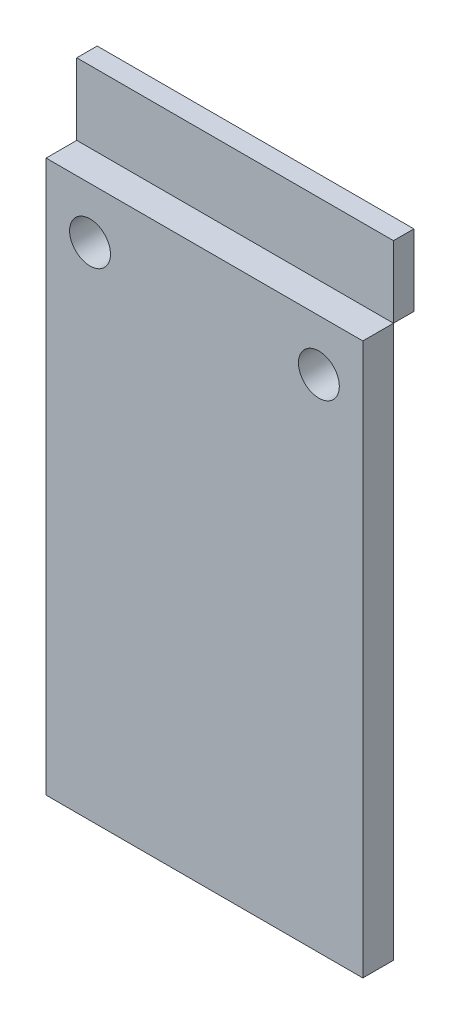
ISO-10303-21;
HEADER;
FILE_DESCRIPTION(('STEP AP214'),'2;1');
FILE_NAME('part.step','',(''),(''),'','','');
FILE_SCHEMA(('AUTOMOTIVE_DESIGN { 1 0 10303 214 1 1 1 1 }'));
ENDSEC;
DATA;
#1=APPLICATION_CONTEXT('core data for automotive mechanical design processes');
#2=APPLICATION_PROTOCOL_DEFINITION('international standard','automotive_design',2000,#1);
#3=PRODUCT_CONTEXT('',#1,'mechanical');
#4=PRODUCT('Part','Part','',(#3));
#5=PRODUCT_RELATED_PRODUCT_CATEGORY('part','',(#4));
#6=PRODUCT_DEFINITION_FORMATION('','',#4);
#7=PRODUCT_DEFINITION_CONTEXT('part definition',#1,'design');
#8=PRODUCT_DEFINITION('design','',#6,#7);
#9=PRODUCT_DEFINITION_SHAPE('','',#8);
#10=(LENGTH_UNIT() NAMED_UNIT(*) SI_UNIT(.MILLI.,.METRE.));
#11=(NAMED_UNIT(*) PLANE_ANGLE_UNIT() SI_UNIT($,.RADIAN.));
#12=(NAMED_UNIT(*) SI_UNIT($,.STERADIAN.) SOLID_ANGLE_UNIT());
#13=UNCERTAINTY_MEASURE_WITH_UNIT(LENGTH_MEASURE(1.E-05),#10,'distance_accuracy_value','');
#14=(GEOMETRIC_REPRESENTATION_CONTEXT(3) GLOBAL_UNCERTAINTY_ASSIGNED_CONTEXT((#13)) GLOBAL_UNIT_ASSIGNED_CONTEXT((#10,
#11,#12)) REPRESENTATION_CONTEXT('',''));
#15=CARTESIAN_POINT('',(0.,0.,0.));
#16=DIRECTION('',(0.,0.,1.));
#17=DIRECTION('',(1.,0.,0.));
#18=AXIS2_PLACEMENT_3D('',#15,#16,#17);
#19=CARTESIAN_POINT('',(7.74999999999999,13.5,-1.));
#20=DIRECTION('',(-1.,0.,0.));
#21=DIRECTION('',(0.,0.,1.));
#22=AXIS2_PLACEMENT_3D('',#19,#20,#21);
#23=PLANE('',#22);
#24=DIRECTION('',(0.,-1.,0.));
#25=VECTOR('',#24,1.);
#26=CARTESIAN_POINT('',(7.74999999999999,13.5,0.));
#27=LINE('',#26,#25);
#28=CARTESIAN_POINT('',(7.74999999999999,17.,0.));
#29=VERTEX_POINT('',#28);
#30=CARTESIAN_POINT('',(7.74999999999999,13.5,0.));
#31=VERTEX_POINT('',#30);
#32=EDGE_CURVE('E112',#29,#31,#27,.T.);
#33=ORIENTED_EDGE('',*,*,#32,.T.);
#34=DIRECTION('',(0.,0.,1.));
#35=VECTOR('',#34,1.);
#36=CARTESIAN_POINT('',(7.74999999999999,13.5,-1.));
#37=LINE('',#36,#35);
#38=CARTESIAN_POINT('',(7.74999999999999,13.5,-1.));
#39=VERTEX_POINT('',#38);
#40=EDGE_CURVE('E12',#39,#31,#37,.T.);
#41=ORIENTED_EDGE('',*,*,#40,.F.);
#42=DIRECTION('',(0.,-1.,0.));
#43=VECTOR('',#42,1.);
#44=CARTESIAN_POINT('',(7.74999999999999,13.5,-1.));
#45=LINE('',#44,#43);
#46=CARTESIAN_POINT('',(7.74999999999999,17.,-1.));
#47=VERTEX_POINT('',#46);
#48=EDGE_CURVE('E100',#47,#39,#45,.T.);
#49=ORIENTED_EDGE('',*,*,#48,.F.);
#50=DIRECTION('',(0.,0.,1.));
#51=VECTOR('',#50,1.);
#52=CARTESIAN_POINT('',(7.74999999999999,17.,-1.));
#53=LINE('',#52,#51);
#54=EDGE_CURVE('E108',#47,#29,#53,.T.);
#55=ORIENTED_EDGE('',*,*,#54,.T.);
#56=EDGE_LOOP('',(#33,#41,#49,#55));
#57=FACE_BOUND('',#56,.T.);
#58=ADVANCED_FACE('F49',(#57),#23,.F.);
#59=CARTESIAN_POINT('',(7.74999999999999,13.5,-1.));
#60=DIRECTION('',(0.,1.,0.));
#61=DIRECTION('',(0.,0.,1.));
#62=AXIS2_PLACEMENT_3D('',#59,#60,#61);
#63=PLANE('',#62);
#64=DIRECTION('',(-1.,0.,0.));
#65=VECTOR('',#64,1.);
#66=CARTESIAN_POINT('',(7.74999999999999,13.5,0.));
#67=LINE('',#66,#65);
#68=CARTESIAN_POINT('',(-7.75,13.5,0.));
#69=VERTEX_POINT('',#68);
#70=EDGE_CURVE('E104',#31,#69,#67,.T.);
#71=ORIENTED_EDGE('',*,*,#70,.T.);
#72=DIRECTION('',(0.,0.,1.));
#73=VECTOR('',#72,1.);
#74=CARTESIAN_POINT('',(-7.75,13.5,-1.));
#75=LINE('',#74,#73);
#76=CARTESIAN_POINT('',(-7.75,13.5,-1.));
#77=VERTEX_POINT('',#76);
#78=EDGE_CURVE('E57',#77,#69,#75,.T.);
#79=ORIENTED_EDGE('',*,*,#78,.F.);
#80=DIRECTION('',(-1.,0.,0.));
#81=VECTOR('',#80,1.);
#82=CARTESIAN_POINT('',(7.74999999999999,13.5,-1.));
#83=LINE('',#82,#81);
#84=EDGE_CURVE('E95',#39,#77,#83,.T.);
#85=ORIENTED_EDGE('',*,*,#84,.F.);
#86=ORIENTED_EDGE('',*,*,#40,.T.);
#87=EDGE_LOOP('',(#71,#79,#85,#86));
#88=FACE_BOUND('',#87,.T.);
#89=ADVANCED_FACE('F103',(#88),#63,.F.);
#90=CARTESIAN_POINT('',(-7.75,13.5,-1.));
#91=DIRECTION('',(1.,0.,0.));
#92=DIRECTION('',(0.,0.,-1.));
#93=AXIS2_PLACEMENT_3D('',#90,#91,#92);
#94=PLANE('',#93);
#95=DIRECTION('',(0.,1.,0.));
#96=VECTOR('',#95,1.);
#97=CARTESIAN_POINT('',(-7.75,13.5,0.));
#98=LINE('',#97,#96);
#99=CARTESIAN_POINT('',(-7.75,17.,0.));
#100=VERTEX_POINT('',#99);
#101=EDGE_CURVE('E82',#69,#100,#98,.T.);
#102=ORIENTED_EDGE('',*,*,#101,.T.);
#103=DIRECTION('',(0.,0.,1.));
#104=VECTOR('',#103,1.);
#105=CARTESIAN_POINT('',(-7.75,17.,-1.));
#106=LINE('',#105,#104);
#107=CARTESIAN_POINT('',(-7.75,17.,-1.));
#108=VERTEX_POINT('',#107);
#109=EDGE_CURVE('E105',#108,#100,#106,.T.);
#110=ORIENTED_EDGE('',*,*,#109,.F.);
#111=DIRECTION('',(0.,1.,0.));
#112=VECTOR('',#111,1.);
#113=CARTESIAN_POINT('',(-7.75,13.5,-1.));
#114=LINE('',#113,#112);
#115=EDGE_CURVE('E98',#77,#108,#114,.T.);
#116=ORIENTED_EDGE('',*,*,#115,.F.);
#117=ORIENTED_EDGE('',*,*,#78,.T.);
#118=EDGE_LOOP('',(#102,#110,#116,#117));
#119=FACE_BOUND('',#118,.T.);
#120=ADVANCED_FACE('F106',(#119),#94,.F.);
#121=CARTESIAN_POINT('',(7.74999999999999,17.,-1.));
#122=DIRECTION('',(0.,-1.,0.));
#123=DIRECTION('',(0.,0.,-1.));
#124=AXIS2_PLACEMENT_3D('',#121,#122,#123);
#125=PLANE('',#124);
#126=DIRECTION('',(1.,0.,0.));
#127=VECTOR('',#126,1.);
#128=CARTESIAN_POINT('',(7.74999999999999,17.,0.));
#129=LINE('',#128,#127);
#130=EDGE_CURVE('E88',#100,#29,#129,.T.);
#131=ORIENTED_EDGE('',*,*,#130,.T.);
#132=ORIENTED_EDGE('',*,*,#54,.F.);
#133=DIRECTION('',(1.,0.,0.));
#134=VECTOR('',#133,1.);
#135=CARTESIAN_POINT('',(7.74999999999999,17.,-1.));
#136=LINE('',#135,#134);
#137=EDGE_CURVE('E65',#108,#47,#136,.T.);
#138=ORIENTED_EDGE('',*,*,#137,.F.);
#139=ORIENTED_EDGE('',*,*,#109,.T.);
#140=EDGE_LOOP('',(#131,#132,#138,#139));
#141=FACE_BOUND('',#140,.T.);
#142=ADVANCED_FACE('F119',(#141),#125,.F.);
#143=CARTESIAN_POINT('',(0.,0.,-1.));
#144=DIRECTION('',(0.,0.,1.));
#145=DIRECTION('',(1.,0.,0.));
#146=AXIS2_PLACEMENT_3D('',#143,#144,#145);
#147=PLANE('',#146);
#148=ORIENTED_EDGE('',*,*,#48,.T.);
#149=ORIENTED_EDGE('',*,*,#84,.T.);
#150=ORIENTED_EDGE('',*,*,#115,.T.);
#151=ORIENTED_EDGE('',*,*,#137,.T.);
#152=EDGE_LOOP('',(#148,#149,#150,#151));
#153=FACE_BOUND('',#152,.T.);
#154=ADVANCED_FACE('F96',(#153),#147,.F.);
#155=CARTESIAN_POINT('',(0.,0.,0.));
#156=DIRECTION('',(0.,0.,1.));
#157=DIRECTION('',(1.,0.,0.));
#158=AXIS2_PLACEMENT_3D('',#155,#156,#157);
#159=PLANE('',#158);
#160=ORIENTED_EDGE('',*,*,#32,.F.);
#161=ORIENTED_EDGE('',*,*,#130,.F.);
#162=ORIENTED_EDGE('',*,*,#101,.F.);
#163=ORIENTED_EDGE('',*,*,#70,.F.);
#164=EDGE_LOOP('',(#160,#161,#162,#163));
#165=FACE_BOUND('',#164,.T.);
#166=ADVANCED_FACE('F122',(#165),#159,.T.);
#167=CLOSED_SHELL('',(#58,#89,#120,#142,#154,#166));
#168=MANIFOLD_SOLID_BREP('B2',#167);
#169=CARTESIAN_POINT('',(0.,0.,1.5));
#170=DIRECTION('',(0.,0.,1.));
#171=DIRECTION('',(1.,0.,0.));
#172=AXIS2_PLACEMENT_3D('',#169,#170,#171);
#173=PLANE('',#172);
#174=CARTESIAN_POINT('',(-5.6,11.,1.5));
#175=DIRECTION('',(0.,0.,1.));
#176=DIRECTION('',(1.,0.,0.));
#177=AXIS2_PLACEMENT_3D('',#174,#175,#176);
#178=CIRCLE('',#177,1.);
#179=CARTESIAN_POINT('',(-4.6,11.,1.5));
#180=VERTEX_POINT('',#179);
#181=EDGE_CURVE('E246',#180,#180,#178,.T.);
#182=ORIENTED_EDGE('',*,*,#181,.F.);
#183=EDGE_LOOP('',(#182));
#184=FACE_BOUND('',#183,.T.);
#185=DIRECTION('',(0.,1.,0.));
#186=VECTOR('',#185,1.);
#187=CARTESIAN_POINT('',(7.74999999999999,13.5,1.5));
#188=LINE('',#187,#186);
#189=CARTESIAN_POINT('',(7.75,-13.5,1.5));
#190=VERTEX_POINT('',#189);
#191=CARTESIAN_POINT('',(7.74999999999999,13.5,1.5));
#192=VERTEX_POINT('',#191);
#193=EDGE_CURVE('E226',#190,#192,#188,.T.);
#194=ORIENTED_EDGE('',*,*,#193,.T.);
#195=DIRECTION('',(-1.,0.,0.));
#196=VECTOR('',#195,1.);
#197=CARTESIAN_POINT('',(-7.75,13.5,1.5));
#198=LINE('',#197,#196);
#199=CARTESIAN_POINT('',(-7.75,13.5,1.5));
#200=VERTEX_POINT('',#199);
#201=EDGE_CURVE('E221',#192,#200,#198,.T.);
#202=ORIENTED_EDGE('',*,*,#201,.T.);
#203=DIRECTION('',(0.,-1.,0.));
#204=VECTOR('',#203,1.);
#205=CARTESIAN_POINT('',(-7.75,13.5,1.5));
#206=LINE('',#205,#204);
#207=CARTESIAN_POINT('',(-7.75,-13.5,1.5));
#208=VERTEX_POINT('',#207);
#209=EDGE_CURVE('E224',#200,#208,#206,.T.);
#210=ORIENTED_EDGE('',*,*,#209,.T.);
#211=DIRECTION('',(1.,0.,0.));
#212=VECTOR('',#211,1.);
#213=CARTESIAN_POINT('',(-7.75,-13.5,1.5));
#214=LINE('',#213,#212);
#215=EDGE_CURVE('E191',#208,#190,#214,.T.);
#216=ORIENTED_EDGE('',*,*,#215,.T.);
#217=EDGE_LOOP('',(#194,#202,#210,#216));
#218=FACE_BOUND('',#217,.T.);
#219=CARTESIAN_POINT('',(5.6,11.,1.5));
#220=DIRECTION('',(0.,0.,1.));
#221=DIRECTION('',(1.,0.,0.));
#222=AXIS2_PLACEMENT_3D('',#219,#220,#221);
#223=CIRCLE('',#222,1.);
#224=CARTESIAN_POINT('',(6.6,11.,1.5));
#225=VERTEX_POINT('',#224);
#226=EDGE_CURVE('E268',#225,#225,#223,.T.);
#227=ORIENTED_EDGE('',*,*,#226,.F.);
#228=EDGE_LOOP('',(#227));
#229=FACE_BOUND('',#228,.T.);
#230=ADVANCED_FACE('F173',(#184,#218,#229),#173,.T.);
#231=CARTESIAN_POINT('',(0.,0.,0.));
#232=DIRECTION('',(0.,0.,1.));
#233=DIRECTION('',(1.,0.,0.));
#234=AXIS2_PLACEMENT_3D('',#231,#232,#233);
#235=PLANE('',#234);
#236=DIRECTION('',(0.,1.,0.));
#237=VECTOR('',#236,1.);
#238=CARTESIAN_POINT('',(7.74999999999999,13.5,0.));
#239=LINE('',#238,#237);
#240=CARTESIAN_POINT('',(7.75,-13.5,0.));
#241=VERTEX_POINT('',#240);
#242=CARTESIAN_POINT('',(7.74999999999999,13.5,0.));
#243=VERTEX_POINT('',#242);
#244=EDGE_CURVE('E242',#241,#243,#239,.T.);
#245=ORIENTED_EDGE('',*,*,#244,.F.);
#246=DIRECTION('',(1.,0.,0.));
#247=VECTOR('',#246,1.);
#248=CARTESIAN_POINT('',(-7.75,-13.5,0.));
#249=LINE('',#248,#247);
#250=CARTESIAN_POINT('',(-7.75,-13.5,0.));
#251=VERTEX_POINT('',#250);
#252=EDGE_CURVE('E214',#251,#241,#249,.T.);
#253=ORIENTED_EDGE('',*,*,#252,.F.);
#254=DIRECTION('',(0.,-1.,0.));
#255=VECTOR('',#254,1.);
#256=CARTESIAN_POINT('',(-7.75,13.5,0.));
#257=LINE('',#256,#255);
#258=CARTESIAN_POINT('',(-7.75,13.5,0.));
#259=VERTEX_POINT('',#258);
#260=EDGE_CURVE('E208',#259,#251,#257,.T.);
#261=ORIENTED_EDGE('',*,*,#260,.F.);
#262=DIRECTION('',(-1.,0.,0.));
#263=VECTOR('',#262,1.);
#264=CARTESIAN_POINT('',(-7.75,13.5,0.));
#265=LINE('',#264,#263);
#266=EDGE_CURVE('E231',#243,#259,#265,.T.);
#267=ORIENTED_EDGE('',*,*,#266,.F.);
#268=EDGE_LOOP('',(#245,#253,#261,#267));
#269=FACE_BOUND('',#268,.T.);
#270=CARTESIAN_POINT('',(-5.6,11.,0.));
#271=DIRECTION('',(0.,0.,1.));
#272=DIRECTION('',(1.,0.,0.));
#273=AXIS2_PLACEMENT_3D('',#270,#271,#272);
#274=CIRCLE('',#273,1.);
#275=CARTESIAN_POINT('',(-4.6,11.,0.));
#276=VERTEX_POINT('',#275);
#277=EDGE_CURVE('E264',#276,#276,#274,.T.);
#278=ORIENTED_EDGE('',*,*,#277,.T.);
#279=EDGE_LOOP('',(#278));
#280=FACE_BOUND('',#279,.T.);
#281=CARTESIAN_POINT('',(5.6,11.,0.));
#282=DIRECTION('',(0.,0.,1.));
#283=DIRECTION('',(1.,0.,0.));
#284=AXIS2_PLACEMENT_3D('',#281,#282,#283);
#285=CIRCLE('',#284,1.);
#286=CARTESIAN_POINT('',(6.6,11.,0.));
#287=VERTEX_POINT('',#286);
#288=EDGE_CURVE('E272',#287,#287,#285,.T.);
#289=ORIENTED_EDGE('',*,*,#288,.T.);
#290=EDGE_LOOP('',(#289));
#291=FACE_BOUND('',#290,.T.);
#292=ADVANCED_FACE('F259',(#269,#280,#291),#235,.F.);
#293=CARTESIAN_POINT('',(7.74999999999999,13.5,1.5));
#294=DIRECTION('',(-1.,0.,0.));
#295=DIRECTION('',(0.,-1.,0.));
#296=AXIS2_PLACEMENT_3D('',#293,#294,#295);
#297=PLANE('',#296);
#298=ORIENTED_EDGE('',*,*,#244,.T.);
#299=DIRECTION('',(0.,0.,-1.));
#300=VECTOR('',#299,1.);
#301=CARTESIAN_POINT('',(7.74999999999999,13.5,1.5));
#302=LINE('',#301,#300);
#303=EDGE_CURVE('E47',#192,#243,#302,.T.);
#304=ORIENTED_EDGE('',*,*,#303,.F.);
#305=ORIENTED_EDGE('',*,*,#193,.F.);
#306=DIRECTION('',(0.,0.,-1.));
#307=VECTOR('',#306,1.);
#308=CARTESIAN_POINT('',(7.75,-13.5,1.5));
#309=LINE('',#308,#307);
#310=EDGE_CURVE('E238',#190,#241,#309,.T.);
#311=ORIENTED_EDGE('',*,*,#310,.T.);
#312=EDGE_LOOP('',(#298,#304,#305,#311));
#313=FACE_BOUND('',#312,.T.);
#314=ADVANCED_FACE('F175',(#313),#297,.F.);
#315=CARTESIAN_POINT('',(-7.75,13.5,1.5));
#316=DIRECTION('',(0.,-1.,0.));
#317=DIRECTION('',(0.,0.,-1.));
#318=AXIS2_PLACEMENT_3D('',#315,#316,#317);
#319=PLANE('',#318);
#320=ORIENTED_EDGE('',*,*,#266,.T.);
#321=DIRECTION('',(0.,0.,-1.));
#322=VECTOR('',#321,1.);
#323=CARTESIAN_POINT('',(-7.75,13.5,1.5));
#324=LINE('',#323,#322);
#325=EDGE_CURVE('E183',#200,#259,#324,.T.);
#326=ORIENTED_EDGE('',*,*,#325,.F.);
#327=ORIENTED_EDGE('',*,*,#201,.F.);
#328=ORIENTED_EDGE('',*,*,#303,.T.);
#329=EDGE_LOOP('',(#320,#326,#327,#328));
#330=FACE_BOUND('',#329,.T.);
#331=ADVANCED_FACE('F230',(#330),#319,.F.);
#332=CARTESIAN_POINT('',(-7.75,13.5,1.5));
#333=DIRECTION('',(1.,0.,0.));
#334=DIRECTION('',(0.,1.,0.));
#335=AXIS2_PLACEMENT_3D('',#332,#333,#334);
#336=PLANE('',#335);
#337=ORIENTED_EDGE('',*,*,#260,.T.);
#338=DIRECTION('',(0.,0.,-1.));
#339=VECTOR('',#338,1.);
#340=CARTESIAN_POINT('',(-7.75,-13.5,1.5));
#341=LINE('',#340,#339);
#342=EDGE_CURVE('E233',#208,#251,#341,.T.);
#343=ORIENTED_EDGE('',*,*,#342,.F.);
#344=ORIENTED_EDGE('',*,*,#209,.F.);
#345=ORIENTED_EDGE('',*,*,#325,.T.);
#346=EDGE_LOOP('',(#337,#343,#344,#345));
#347=FACE_BOUND('',#346,.T.);
#348=ADVANCED_FACE('F234',(#347),#336,.F.);
#349=CARTESIAN_POINT('',(-7.75,-13.5,1.5));
#350=DIRECTION('',(0.,1.,0.));
#351=DIRECTION('',(0.,0.,1.));
#352=AXIS2_PLACEMENT_3D('',#349,#350,#351);
#353=PLANE('',#352);
#354=ORIENTED_EDGE('',*,*,#252,.T.);
#355=ORIENTED_EDGE('',*,*,#310,.F.);
#356=ORIENTED_EDGE('',*,*,#215,.F.);
#357=ORIENTED_EDGE('',*,*,#342,.T.);
#358=EDGE_LOOP('',(#354,#355,#356,#357));
#359=FACE_BOUND('',#358,.T.);
#360=ADVANCED_FACE('F256',(#359),#353,.F.);
#361=CARTESIAN_POINT('',(-5.6,11.,1.5));
#362=DIRECTION('',(0.,0.,-1.));
#363=DIRECTION('',(-1.,0.,0.));
#364=AXIS2_PLACEMENT_3D('',#361,#362,#363);
#365=CYLINDRICAL_SURFACE('',#364,1.);
#366=ORIENTED_EDGE('',*,*,#181,.T.);
#367=EDGE_LOOP('',(#366));
#368=FACE_BOUND('',#367,.T.);
#369=ORIENTED_EDGE('',*,*,#277,.F.);
#370=EDGE_LOOP('',(#369));
#371=FACE_BOUND('',#370,.T.);
#372=ADVANCED_FACE('F291',(#368,#371),#365,.F.);
#373=CARTESIAN_POINT('',(5.6,11.,1.5));
#374=DIRECTION('',(0.,0.,-1.));
#375=DIRECTION('',(-1.,0.,0.));
#376=AXIS2_PLACEMENT_3D('',#373,#374,#375);
#377=CYLINDRICAL_SURFACE('',#376,1.);
#378=ORIENTED_EDGE('',*,*,#226,.T.);
#379=EDGE_LOOP('',(#378));
#380=FACE_BOUND('',#379,.T.);
#381=ORIENTED_EDGE('',*,*,#288,.F.);
#382=EDGE_LOOP('',(#381));
#383=FACE_BOUND('',#382,.T.);
#384=ADVANCED_FACE('F280',(#380,#383),#377,.F.);
#385=CLOSED_SHELL('',(#230,#292,#314,#331,#348,#360,#372,#384));
#386=MANIFOLD_SOLID_BREP('B6',#385);
#387=ADVANCED_BREP_SHAPE_REPRESENTATION('',(#18,#168,#386),#14);
#388=SHAPE_DEFINITION_REPRESENTATION(#9,#387);
ENDSEC;
END-ISO-10303-21;
